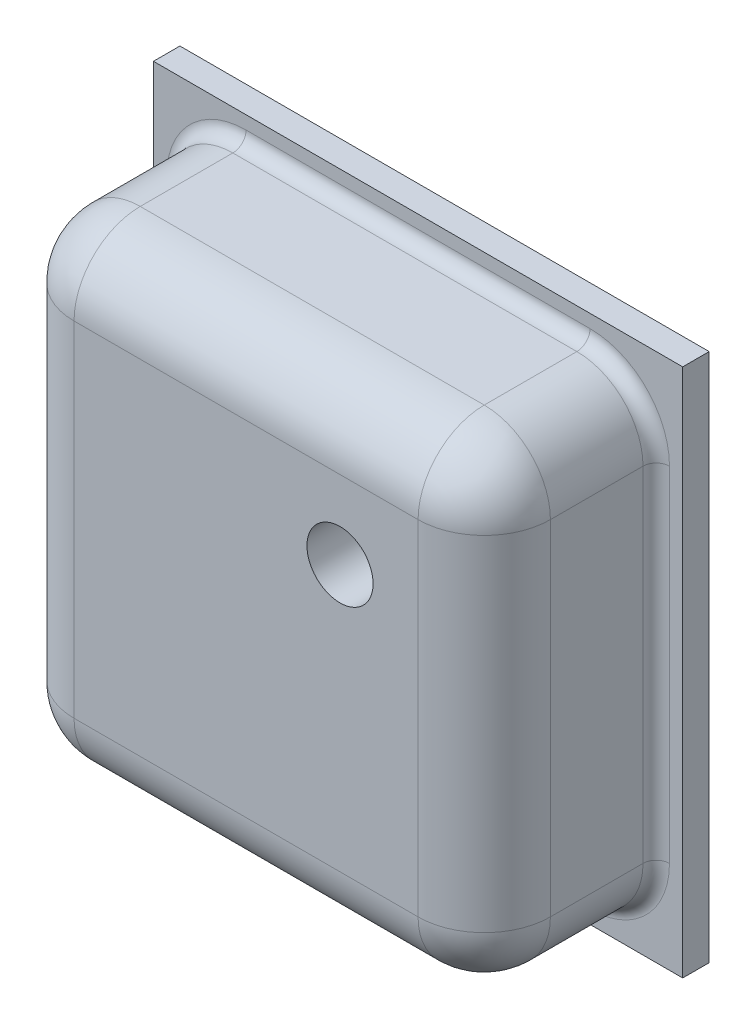
ISO-10303-21;
HEADER;
FILE_DESCRIPTION(('STEP AP214'),'2;1');
FILE_NAME('part.step','',(''),(''),'','','');
FILE_SCHEMA(('AUTOMOTIVE_DESIGN { 1 0 10303 214 1 1 1 1 }'));
ENDSEC;
DATA;
#1=APPLICATION_CONTEXT('core data for automotive mechanical design processes');
#2=APPLICATION_PROTOCOL_DEFINITION('international standard','automotive_design',2000,#1);
#3=PRODUCT_CONTEXT('',#1,'mechanical');
#4=PRODUCT('Part','Part','',(#3));
#5=PRODUCT_RELATED_PRODUCT_CATEGORY('part','',(#4));
#6=PRODUCT_DEFINITION_FORMATION('','',#4);
#7=PRODUCT_DEFINITION_CONTEXT('part definition',#1,'design');
#8=PRODUCT_DEFINITION('design','',#6,#7);
#9=PRODUCT_DEFINITION_SHAPE('','',#8);
#10=(LENGTH_UNIT() NAMED_UNIT(*) SI_UNIT(.MILLI.,.METRE.));
#11=(NAMED_UNIT(*) PLANE_ANGLE_UNIT() SI_UNIT($,.RADIAN.));
#12=(NAMED_UNIT(*) SI_UNIT($,.STERADIAN.) SOLID_ANGLE_UNIT());
#13=UNCERTAINTY_MEASURE_WITH_UNIT(LENGTH_MEASURE(1.E-05),#10,'distance_accuracy_value','');
#14=(GEOMETRIC_REPRESENTATION_CONTEXT(3) GLOBAL_UNCERTAINTY_ASSIGNED_CONTEXT((#13)) GLOBAL_UNIT_ASSIGNED_CONTEXT((#10,
#11,#12)) REPRESENTATION_CONTEXT('',''));
#15=CARTESIAN_POINT('',(0.,0.,0.));
#16=DIRECTION('',(0.,0.,1.));
#17=DIRECTION('',(1.,0.,0.));
#18=AXIS2_PLACEMENT_3D('',#15,#16,#17);
#19=CARTESIAN_POINT('',(0.,0.,0.1));
#20=DIRECTION('',(0.,0.,1.));
#21=DIRECTION('',(1.,0.,0.));
#22=AXIS2_PLACEMENT_3D('',#19,#20,#21);
#23=PLANE('',#22);
#24=DIRECTION('',(0.,-1.,0.));
#25=VECTOR('',#24,1.);
#26=CARTESIAN_POINT('',(0.949999999999999,0.,0.1));
#27=LINE('',#26,#25);
#28=CARTESIAN_POINT('',(0.949999999999999,0.65,0.1));
#29=VERTEX_POINT('',#28);
#30=CARTESIAN_POINT('',(0.949999999999999,-0.65,0.1));
#31=VERTEX_POINT('',#30);
#32=EDGE_CURVE('E276',#29,#31,#27,.T.);
#33=ORIENTED_EDGE('',*,*,#32,.T.);
#34=CARTESIAN_POINT('',(0.649999999999999,-0.65,0.1));
#35=DIRECTION('',(0.,0.,1.));
#36=DIRECTION('',(1.,0.,0.));
#37=AXIS2_PLACEMENT_3D('',#34,#35,#36);
#38=CIRCLE('',#37,0.3);
#39=CARTESIAN_POINT('',(0.649999999999999,-0.95,0.1));
#40=VERTEX_POINT('',#39);
#41=EDGE_CURVE('E278',#31,#40,#38,.F.);
#42=ORIENTED_EDGE('',*,*,#41,.T.);
#43=DIRECTION('',(-1.,0.,0.));
#44=VECTOR('',#43,1.);
#45=CARTESIAN_POINT('',(0.,-0.95,0.1));
#46=LINE('',#45,#44);
#47=CARTESIAN_POINT('',(-0.65,-0.95,0.1));
#48=VERTEX_POINT('',#47);
#49=EDGE_CURVE('E229',#40,#48,#46,.T.);
#50=ORIENTED_EDGE('',*,*,#49,.T.);
#51=CARTESIAN_POINT('',(-0.65,-0.65,0.1));
#52=DIRECTION('',(0.,0.,1.));
#53=DIRECTION('',(1.,0.,0.));
#54=AXIS2_PLACEMENT_3D('',#51,#52,#53);
#55=CIRCLE('',#54,0.3);
#56=CARTESIAN_POINT('',(-0.95,-0.65,0.1));
#57=VERTEX_POINT('',#56);
#58=EDGE_CURVE('E266',#48,#57,#55,.F.);
#59=ORIENTED_EDGE('',*,*,#58,.T.);
#60=DIRECTION('',(0.,1.,0.));
#61=VECTOR('',#60,1.);
#62=CARTESIAN_POINT('',(-0.950000000000001,0.,0.1));
#63=LINE('',#62,#61);
#64=CARTESIAN_POINT('',(-0.950000000000001,0.65,0.1));
#65=VERTEX_POINT('',#64);
#66=EDGE_CURVE('E268',#57,#65,#63,.T.);
#67=ORIENTED_EDGE('',*,*,#66,.T.);
#68=CARTESIAN_POINT('',(-0.650000000000001,0.65,0.1));
#69=DIRECTION('',(0.,0.,1.));
#70=DIRECTION('',(1.,0.,0.));
#71=AXIS2_PLACEMENT_3D('',#68,#69,#70);
#72=CIRCLE('',#71,0.3);
#73=CARTESIAN_POINT('',(-0.650000000000001,0.95,0.1));
#74=VERTEX_POINT('',#73);
#75=EDGE_CURVE('E270',#65,#74,#72,.F.);
#76=ORIENTED_EDGE('',*,*,#75,.T.);
#77=DIRECTION('',(1.,0.,0.));
#78=VECTOR('',#77,1.);
#79=CARTESIAN_POINT('',(0.,0.95,0.1));
#80=LINE('',#79,#78);
#81=CARTESIAN_POINT('',(0.649999999999999,0.95,0.1));
#82=VERTEX_POINT('',#81);
#83=EDGE_CURVE('E272',#74,#82,#80,.T.);
#84=ORIENTED_EDGE('',*,*,#83,.T.);
#85=CARTESIAN_POINT('',(0.649999999999999,0.65,0.1));
#86=DIRECTION('',(0.,0.,1.));
#87=DIRECTION('',(1.,0.,0.));
#88=AXIS2_PLACEMENT_3D('',#85,#86,#87);
#89=CIRCLE('',#88,0.3);
#90=EDGE_CURVE('E274',#82,#29,#89,.F.);
#91=ORIENTED_EDGE('',*,*,#90,.T.);
#92=EDGE_LOOP('',(#33,#42,#50,#59,#67,#76,#84,#91));
#93=FACE_BOUND('',#92,.T.);
#94=DIRECTION('',(0.,1.,0.));
#95=VECTOR('',#94,1.);
#96=CARTESIAN_POINT('',(0.999999999999999,1.,0.1));
#97=LINE('',#96,#95);
#98=CARTESIAN_POINT('',(0.999999999999999,-1.,0.1));
#99=VERTEX_POINT('',#98);
#100=CARTESIAN_POINT('',(0.999999999999999,1.,0.1));
#101=VERTEX_POINT('',#100);
#102=EDGE_CURVE('E175',#99,#101,#97,.T.);
#103=ORIENTED_EDGE('',*,*,#102,.T.);
#104=DIRECTION('',(-1.,0.,0.));
#105=VECTOR('',#104,1.);
#106=CARTESIAN_POINT('',(-1.,1.,0.1));
#107=LINE('',#106,#105);
#108=CARTESIAN_POINT('',(-1.,1.,0.1));
#109=VERTEX_POINT('',#108);
#110=EDGE_CURVE('E164',#101,#109,#107,.T.);
#111=ORIENTED_EDGE('',*,*,#110,.T.);
#112=DIRECTION('',(0.,-1.,0.));
#113=VECTOR('',#112,1.);
#114=CARTESIAN_POINT('',(-1.,1.,0.1));
#115=LINE('',#114,#113);
#116=CARTESIAN_POINT('',(-1.,-1.,0.1));
#117=VERTEX_POINT('',#116);
#118=EDGE_CURVE('E174',#109,#117,#115,.T.);
#119=ORIENTED_EDGE('',*,*,#118,.T.);
#120=DIRECTION('',(1.,0.,0.));
#121=VECTOR('',#120,1.);
#122=CARTESIAN_POINT('',(-1.,-1.,0.1));
#123=LINE('',#122,#121);
#124=EDGE_CURVE('E179',#117,#99,#123,.T.);
#125=ORIENTED_EDGE('',*,*,#124,.T.);
#126=EDGE_LOOP('',(#103,#111,#119,#125));
#127=FACE_BOUND('',#126,.T.);
#128=ADVANCED_FACE('F37',(#93,#127),#23,.T.);
#129=CARTESIAN_POINT('',(0.999999999999999,1.,0.1));
#130=DIRECTION('',(-1.,0.,0.));
#131=DIRECTION('',(0.,-1.,0.));
#132=AXIS2_PLACEMENT_3D('',#129,#130,#131);
#133=PLANE('',#132);
#134=DIRECTION('',(0.,1.,0.));
#135=VECTOR('',#134,1.);
#136=CARTESIAN_POINT('',(0.999999999999999,1.,0.));
#137=LINE('',#136,#135);
#138=CARTESIAN_POINT('',(0.999999999999999,-1.,0.));
#139=VERTEX_POINT('',#138);
#140=CARTESIAN_POINT('',(0.999999999999999,1.,0.));
#141=VERTEX_POINT('',#140);
#142=EDGE_CURVE('E187',#139,#141,#137,.T.);
#143=ORIENTED_EDGE('',*,*,#142,.T.);
#144=DIRECTION('',(0.,0.,-1.));
#145=VECTOR('',#144,1.);
#146=CARTESIAN_POINT('',(0.999999999999999,1.,0.1));
#147=LINE('',#146,#145);
#148=EDGE_CURVE('E168',#101,#141,#147,.T.);
#149=ORIENTED_EDGE('',*,*,#148,.F.);
#150=ORIENTED_EDGE('',*,*,#102,.F.);
#151=DIRECTION('',(0.,0.,-1.));
#152=VECTOR('',#151,1.);
#153=CARTESIAN_POINT('',(0.999999999999999,-1.,0.1));
#154=LINE('',#153,#152);
#155=EDGE_CURVE('E698',#99,#139,#154,.T.);
#156=ORIENTED_EDGE('',*,*,#155,.T.);
#157=EDGE_LOOP('',(#143,#149,#150,#156));
#158=FACE_BOUND('',#157,.T.);
#159=ADVANCED_FACE('F185',(#158),#133,.F.);
#160=CARTESIAN_POINT('',(-1.,1.,0.1));
#161=DIRECTION('',(0.,-1.,0.));
#162=DIRECTION('',(0.,0.,-1.));
#163=AXIS2_PLACEMENT_3D('',#160,#161,#162);
#164=PLANE('',#163);
#165=DIRECTION('',(-1.,0.,0.));
#166=VECTOR('',#165,1.);
#167=CARTESIAN_POINT('',(-1.,1.,0.));
#168=LINE('',#167,#166);
#169=CARTESIAN_POINT('',(-1.,1.,0.));
#170=VERTEX_POINT('',#169);
#171=EDGE_CURVE('E700',#141,#170,#168,.T.);
#172=ORIENTED_EDGE('',*,*,#171,.T.);
#173=DIRECTION('',(0.,0.,-1.));
#174=VECTOR('',#173,1.);
#175=CARTESIAN_POINT('',(-1.,1.,0.1));
#176=LINE('',#175,#174);
#177=EDGE_CURVE('E171',#109,#170,#176,.T.);
#178=ORIENTED_EDGE('',*,*,#177,.F.);
#179=ORIENTED_EDGE('',*,*,#110,.F.);
#180=ORIENTED_EDGE('',*,*,#148,.T.);
#181=EDGE_LOOP('',(#172,#178,#179,#180));
#182=FACE_BOUND('',#181,.T.);
#183=ADVANCED_FACE('F166',(#182),#164,.F.);
#184=CARTESIAN_POINT('',(-1.,1.,0.1));
#185=DIRECTION('',(1.,0.,0.));
#186=DIRECTION('',(0.,1.,0.));
#187=AXIS2_PLACEMENT_3D('',#184,#185,#186);
#188=PLANE('',#187);
#189=DIRECTION('',(0.,-1.,0.));
#190=VECTOR('',#189,1.);
#191=CARTESIAN_POINT('',(-1.,1.,0.));
#192=LINE('',#191,#190);
#193=CARTESIAN_POINT('',(-1.,-1.,0.));
#194=VERTEX_POINT('',#193);
#195=EDGE_CURVE('E702',#170,#194,#192,.T.);
#196=ORIENTED_EDGE('',*,*,#195,.T.);
#197=DIRECTION('',(0.,0.,-1.));
#198=VECTOR('',#197,1.);
#199=CARTESIAN_POINT('',(-1.,-1.,0.1));
#200=LINE('',#199,#198);
#201=EDGE_CURVE('E192',#117,#194,#200,.T.);
#202=ORIENTED_EDGE('',*,*,#201,.F.);
#203=ORIENTED_EDGE('',*,*,#118,.F.);
#204=ORIENTED_EDGE('',*,*,#177,.T.);
#205=EDGE_LOOP('',(#196,#202,#203,#204));
#206=FACE_BOUND('',#205,.T.);
#207=ADVANCED_FACE('F389',(#206),#188,.F.);
#208=CARTESIAN_POINT('',(-1.,-1.,0.1));
#209=DIRECTION('',(0.,1.,0.));
#210=DIRECTION('',(0.,0.,1.));
#211=AXIS2_PLACEMENT_3D('',#208,#209,#210);
#212=PLANE('',#211);
#213=DIRECTION('',(1.,0.,0.));
#214=VECTOR('',#213,1.);
#215=CARTESIAN_POINT('',(-1.,-1.,0.));
#216=LINE('',#215,#214);
#217=EDGE_CURVE('E183',#194,#139,#216,.T.);
#218=ORIENTED_EDGE('',*,*,#217,.T.);
#219=ORIENTED_EDGE('',*,*,#155,.F.);
#220=ORIENTED_EDGE('',*,*,#124,.F.);
#221=ORIENTED_EDGE('',*,*,#201,.T.);
#222=EDGE_LOOP('',(#218,#219,#220,#221));
#223=FACE_BOUND('',#222,.T.);
#224=ADVANCED_FACE('F385',(#223),#212,.F.);
#225=CARTESIAN_POINT('',(0.,0.,0.));
#226=DIRECTION('',(0.,0.,1.));
#227=DIRECTION('',(1.,0.,0.));
#228=AXIS2_PLACEMENT_3D('',#225,#226,#227);
#229=PLANE('',#228);
#230=ORIENTED_EDGE('',*,*,#142,.F.);
#231=ORIENTED_EDGE('',*,*,#217,.F.);
#232=ORIENTED_EDGE('',*,*,#195,.F.);
#233=ORIENTED_EDGE('',*,*,#171,.F.);
#234=EDGE_LOOP('',(#230,#231,#232,#233));
#235=FACE_BOUND('',#234,.T.);
#236=ADVANCED_FACE('F382',(#235),#229,.F.);
#237=CARTESIAN_POINT('',(-0.9,-0.9,0.75));
#238=DIRECTION('',(0.,1.,0.));
#239=DIRECTION('',(0.,0.,1.));
#240=AXIS2_PLACEMENT_3D('',#237,#238,#239);
#241=PLANE('',#240);
#242=DIRECTION('',(0.,0.,-1.));
#243=VECTOR('',#242,1.);
#244=CARTESIAN_POINT('',(-0.65,-0.9,0.75));
#245=LINE('',#244,#243);
#246=CARTESIAN_POINT('',(-0.65,-0.9,0.5));
#247=VERTEX_POINT('',#246);
#248=CARTESIAN_POINT('',(-0.65,-0.9,0.15));
#249=VERTEX_POINT('',#248);
#250=EDGE_CURVE('E207',#247,#249,#245,.T.);
#251=ORIENTED_EDGE('',*,*,#250,.T.);
#252=DIRECTION('',(-1.,0.,0.));
#253=VECTOR('',#252,1.);
#254=CARTESIAN_POINT('',(-0.9,-0.9,0.15));
#255=LINE('',#254,#253);
#256=CARTESIAN_POINT('',(0.649999999999999,-0.9,0.15));
#257=VERTEX_POINT('',#256);
#258=EDGE_CURVE('E11',#249,#257,#255,.F.);
#259=ORIENTED_EDGE('',*,*,#258,.T.);
#260=DIRECTION('',(0.,0.,-1.));
#261=VECTOR('',#260,1.);
#262=CARTESIAN_POINT('',(0.649999999999999,-0.9,0.75));
#263=LINE('',#262,#261);
#264=CARTESIAN_POINT('',(0.649999999999999,-0.9,0.5));
#265=VERTEX_POINT('',#264);
#266=EDGE_CURVE('E202',#257,#265,#263,.F.);
#267=ORIENTED_EDGE('',*,*,#266,.T.);
#268=DIRECTION('',(1.,0.,0.));
#269=VECTOR('',#268,1.);
#270=CARTESIAN_POINT('',(-0.9,-0.9,0.5));
#271=LINE('',#270,#269);
#272=EDGE_CURVE('E204',#265,#247,#271,.F.);
#273=ORIENTED_EDGE('',*,*,#272,.T.);
#274=EDGE_LOOP('',(#251,#259,#267,#273));
#275=FACE_BOUND('',#274,.T.);
#276=ADVANCED_FACE('F380',(#275),#241,.F.);
#277=CARTESIAN_POINT('',(0.899999999999999,-0.9,0.75));
#278=DIRECTION('',(-1.,0.,0.));
#279=DIRECTION('',(0.,-1.,0.));
#280=AXIS2_PLACEMENT_3D('',#277,#278,#279);
#281=PLANE('',#280);
#282=DIRECTION('',(0.,0.,-1.));
#283=VECTOR('',#282,1.);
#284=CARTESIAN_POINT('',(0.899999999999999,-0.65,0.75));
#285=LINE('',#284,#283);
#286=CARTESIAN_POINT('',(0.899999999999999,-0.65,0.5));
#287=VERTEX_POINT('',#286);
#288=CARTESIAN_POINT('',(0.899999999999999,-0.65,0.15));
#289=VERTEX_POINT('',#288);
#290=EDGE_CURVE('E209',#287,#289,#285,.T.);
#291=ORIENTED_EDGE('',*,*,#290,.T.);
#292=DIRECTION('',(0.,-1.,0.));
#293=VECTOR('',#292,1.);
#294=CARTESIAN_POINT('',(0.899999999999999,-0.9,0.15));
#295=LINE('',#294,#293);
#296=CARTESIAN_POINT('',(0.899999999999999,0.65,0.15));
#297=VERTEX_POINT('',#296);
#298=EDGE_CURVE('E284',#289,#297,#295,.F.);
#299=ORIENTED_EDGE('',*,*,#298,.T.);
#300=DIRECTION('',(0.,0.,-1.));
#301=VECTOR('',#300,1.);
#302=CARTESIAN_POINT('',(0.899999999999999,0.65,0.75));
#303=LINE('',#302,#301);
#304=CARTESIAN_POINT('',(0.899999999999999,0.65,0.5));
#305=VERTEX_POINT('',#304);
#306=EDGE_CURVE('E214',#297,#305,#303,.F.);
#307=ORIENTED_EDGE('',*,*,#306,.T.);
#308=DIRECTION('',(0.,1.,0.));
#309=VECTOR('',#308,1.);
#310=CARTESIAN_POINT('',(0.899999999999999,-0.9,0.5));
#311=LINE('',#310,#309);
#312=EDGE_CURVE('E212',#305,#287,#311,.F.);
#313=ORIENTED_EDGE('',*,*,#312,.T.);
#314=EDGE_LOOP('',(#291,#299,#307,#313));
#315=FACE_BOUND('',#314,.T.);
#316=ADVANCED_FACE('F602',(#315),#281,.F.);
#317=CARTESIAN_POINT('',(0.899999999999999,0.9,0.75));
#318=DIRECTION('',(0.,-1.,0.));
#319=DIRECTION('',(0.,0.,-1.));
#320=AXIS2_PLACEMENT_3D('',#317,#318,#319);
#321=PLANE('',#320);
#322=DIRECTION('',(0.,0.,-1.));
#323=VECTOR('',#322,1.);
#324=CARTESIAN_POINT('',(0.649999999999999,0.9,0.75));
#325=LINE('',#324,#323);
#326=CARTESIAN_POINT('',(0.649999999999999,0.9,0.5));
#327=VERTEX_POINT('',#326);
#328=CARTESIAN_POINT('',(0.649999999999999,0.9,0.15));
#329=VERTEX_POINT('',#328);
#330=EDGE_CURVE('E216',#327,#329,#325,.T.);
#331=ORIENTED_EDGE('',*,*,#330,.T.);
#332=DIRECTION('',(1.,0.,0.));
#333=VECTOR('',#332,1.);
#334=CARTESIAN_POINT('',(0.899999999999999,0.9,0.15));
#335=LINE('',#334,#333);
#336=CARTESIAN_POINT('',(-0.650000000000001,0.9,0.15));
#337=VERTEX_POINT('',#336);
#338=EDGE_CURVE('E288',#329,#337,#335,.F.);
#339=ORIENTED_EDGE('',*,*,#338,.T.);
#340=DIRECTION('',(0.,0.,-1.));
#341=VECTOR('',#340,1.);
#342=CARTESIAN_POINT('',(-0.650000000000001,0.9,0.75));
#343=LINE('',#342,#341);
#344=CARTESIAN_POINT('',(-0.650000000000001,0.9,0.5));
#345=VERTEX_POINT('',#344);
#346=EDGE_CURVE('E221',#337,#345,#343,.F.);
#347=ORIENTED_EDGE('',*,*,#346,.T.);
#348=DIRECTION('',(-1.,0.,0.));
#349=VECTOR('',#348,1.);
#350=CARTESIAN_POINT('',(0.899999999999999,0.9,0.5));
#351=LINE('',#350,#349);
#352=EDGE_CURVE('E219',#345,#327,#351,.F.);
#353=ORIENTED_EDGE('',*,*,#352,.T.);
#354=EDGE_LOOP('',(#331,#339,#347,#353));
#355=FACE_BOUND('',#354,.T.);
#356=ADVANCED_FACE('F594',(#355),#321,.F.);
#357=CARTESIAN_POINT('',(-0.900000000000001,0.9,0.75));
#358=DIRECTION('',(1.,0.,0.));
#359=DIRECTION('',(0.,1.,0.));
#360=AXIS2_PLACEMENT_3D('',#357,#358,#359);
#361=PLANE('',#360);
#362=DIRECTION('',(0.,0.,-1.));
#363=VECTOR('',#362,1.);
#364=CARTESIAN_POINT('',(-0.900000000000001,0.65,0.75));
#365=LINE('',#364,#363);
#366=CARTESIAN_POINT('',(-0.900000000000001,0.65,0.5));
#367=VERTEX_POINT('',#366);
#368=CARTESIAN_POINT('',(-0.900000000000001,0.65,0.15));
#369=VERTEX_POINT('',#368);
#370=EDGE_CURVE('E227',#367,#369,#365,.T.);
#371=ORIENTED_EDGE('',*,*,#370,.T.);
#372=DIRECTION('',(0.,1.,0.));
#373=VECTOR('',#372,1.);
#374=CARTESIAN_POINT('',(-0.900000000000001,0.9,0.15));
#375=LINE('',#374,#373);
#376=CARTESIAN_POINT('',(-0.9,-0.65,0.15));
#377=VERTEX_POINT('',#376);
#378=EDGE_CURVE('E61',#369,#377,#375,.F.);
#379=ORIENTED_EDGE('',*,*,#378,.T.);
#380=DIRECTION('',(0.,0.,-1.));
#381=VECTOR('',#380,1.);
#382=CARTESIAN_POINT('',(-0.9,-0.65,0.75));
#383=LINE('',#382,#381);
#384=CARTESIAN_POINT('',(-0.9,-0.65,0.5));
#385=VERTEX_POINT('',#384);
#386=EDGE_CURVE('E223',#377,#385,#383,.F.);
#387=ORIENTED_EDGE('',*,*,#386,.T.);
#388=DIRECTION('',(0.,-1.,0.));
#389=VECTOR('',#388,1.);
#390=CARTESIAN_POINT('',(-0.900000000000001,0.9,0.5));
#391=LINE('',#390,#389);
#392=EDGE_CURVE('E225',#385,#367,#391,.F.);
#393=ORIENTED_EDGE('',*,*,#392,.T.);
#394=EDGE_LOOP('',(#371,#379,#387,#393));
#395=FACE_BOUND('',#394,.T.);
#396=ADVANCED_FACE('F329',(#395),#361,.F.);
#397=CARTESIAN_POINT('',(0.,0.,0.75));
#398=DIRECTION('',(0.,0.,1.));
#399=DIRECTION('',(1.,0.,0.));
#400=AXIS2_PLACEMENT_3D('',#397,#398,#399);
#401=PLANE('',#400);
#402=DIRECTION('',(0.,-1.,0.));
#403=VECTOR('',#402,1.);
#404=CARTESIAN_POINT('',(-0.65,-0.9,0.75));
#405=LINE('',#404,#403);
#406=CARTESIAN_POINT('',(-0.650000000000001,0.65,0.75));
#407=VERTEX_POINT('',#406);
#408=CARTESIAN_POINT('',(-0.65,-0.65,0.75));
#409=VERTEX_POINT('',#408);
#410=EDGE_CURVE('E188',#407,#409,#405,.T.);
#411=ORIENTED_EDGE('',*,*,#410,.T.);
#412=DIRECTION('',(1.,0.,0.));
#413=VECTOR('',#412,1.);
#414=CARTESIAN_POINT('',(0.899999999999999,-0.65,0.75));
#415=LINE('',#414,#413);
#416=CARTESIAN_POINT('',(0.649999999999999,-0.65,0.75));
#417=VERTEX_POINT('',#416);
#418=EDGE_CURVE('E199',#409,#417,#415,.T.);
#419=ORIENTED_EDGE('',*,*,#418,.T.);
#420=DIRECTION('',(0.,1.,0.));
#421=VECTOR('',#420,1.);
#422=CARTESIAN_POINT('',(0.649999999999999,0.9,0.75));
#423=LINE('',#422,#421);
#424=CARTESIAN_POINT('',(0.649999999999999,0.65,0.75));
#425=VERTEX_POINT('',#424);
#426=EDGE_CURVE('E197',#417,#425,#423,.T.);
#427=ORIENTED_EDGE('',*,*,#426,.T.);
#428=DIRECTION('',(-1.,0.,0.));
#429=VECTOR('',#428,1.);
#430=CARTESIAN_POINT('',(-0.900000000000001,0.65,0.75));
#431=LINE('',#430,#429);
#432=EDGE_CURVE('E190',#425,#407,#431,.T.);
#433=ORIENTED_EDGE('',*,*,#432,.T.);
#434=EDGE_LOOP('',(#411,#419,#427,#433));
#435=FACE_BOUND('',#434,.T.);
#436=CARTESIAN_POINT('',(0.354999999999999,0.355,0.75));
#437=DIRECTION('',(0.,0.,1.));
#438=DIRECTION('',(1.,0.,0.));
#439=AXIS2_PLACEMENT_3D('',#436,#437,#438);
#440=CIRCLE('',#439,0.125);
#441=CARTESIAN_POINT('',(0.479999999999999,0.355,0.75));
#442=VERTEX_POINT('',#441);
#443=EDGE_CURVE('E264',#442,#442,#440,.T.);
#444=ORIENTED_EDGE('',*,*,#443,.F.);
#445=EDGE_LOOP('',(#444));
#446=FACE_BOUND('',#445,.T.);
#447=ADVANCED_FACE('F348',(#435,#446),#401,.T.);
#448=CARTESIAN_POINT('',(0.354999999999999,0.355,-0.253553390593274));
#449=DIRECTION('',(0.,0.,1.));
#450=DIRECTION('',(1.,0.,0.));
#451=AXIS2_PLACEMENT_3D('',#448,#449,#450);
#452=CYLINDRICAL_SURFACE('',#451,0.125);
#453=CARTESIAN_POINT('',(0.354999999999999,0.355,0.1));
#454=DIRECTION('',(0.,0.,1.));
#455=DIRECTION('',(1.,0.,0.));
#456=AXIS2_PLACEMENT_3D('',#453,#454,#455);
#457=CIRCLE('',#456,0.125);
#458=CARTESIAN_POINT('',(0.479999999999999,0.355,0.1));
#459=VERTEX_POINT('',#458);
#460=EDGE_CURVE('E690',#459,#459,#457,.F.);
#461=ORIENTED_EDGE('',*,*,#460,.T.);
#462=EDGE_LOOP('',(#461));
#463=FACE_BOUND('',#462,.T.);
#464=ORIENTED_EDGE('',*,*,#443,.T.);
#465=EDGE_LOOP('',(#464));
#466=FACE_BOUND('',#465,.T.);
#467=ADVANCED_FACE('F569',(#463,#466),#452,.F.);
#468=CARTESIAN_POINT('',(0.,0.,0.1));
#469=DIRECTION('',(0.,0.,1.));
#470=DIRECTION('',(1.,0.,0.));
#471=AXIS2_PLACEMENT_3D('',#468,#469,#470);
#472=PLANE('',#471);
#473=ORIENTED_EDGE('',*,*,#460,.F.);
#474=EDGE_LOOP('',(#473));
#475=FACE_BOUND('',#474,.T.);
#476=ADVANCED_FACE('F560',(#475),#472,.T.);
#477=CARTESIAN_POINT('',(-0.650000000000001,0.65,0.75));
#478=DIRECTION('',(0.,0.,-1.));
#479=DIRECTION('',(-1.,0.,0.));
#480=AXIS2_PLACEMENT_3D('',#477,#478,#479);
#481=CYLINDRICAL_SURFACE('',#480,0.25);
#482=ORIENTED_EDGE('',*,*,#346,.F.);
#483=CARTESIAN_POINT('',(-0.650000000000001,0.65,0.15));
#484=DIRECTION('',(0.,0.,1.));
#485=DIRECTION('',(1.,0.,0.));
#486=AXIS2_PLACEMENT_3D('',#483,#484,#485);
#487=CIRCLE('',#486,0.25);
#488=EDGE_CURVE('E290',#337,#369,#487,.T.);
#489=ORIENTED_EDGE('',*,*,#488,.T.);
#490=ORIENTED_EDGE('',*,*,#370,.F.);
#491=CARTESIAN_POINT('',(-0.650000000000001,0.65,0.5));
#492=DIRECTION('',(0.,0.,1.));
#493=DIRECTION('',(1.,0.,0.));
#494=AXIS2_PLACEMENT_3D('',#491,#492,#493);
#495=CIRCLE('',#494,0.25);
#496=EDGE_CURVE('E261',#345,#367,#495,.T.);
#497=ORIENTED_EDGE('',*,*,#496,.F.);
#498=EDGE_LOOP('',(#482,#489,#490,#497));
#499=FACE_BOUND('',#498,.T.);
#500=ADVANCED_FACE('F327',(#499),#481,.T.);
#501=CARTESIAN_POINT('',(0.,0.65,0.5));
#502=DIRECTION('',(1.,0.,0.));
#503=DIRECTION('',(0.,0.,-1.));
#504=AXIS2_PLACEMENT_3D('',#501,#502,#503);
#505=CYLINDRICAL_SURFACE('',#504,0.25);
#506=CARTESIAN_POINT('',(0.649999999999999,0.65,0.5));
#507=DIRECTION('',(1.,0.,0.));
#508=DIRECTION('',(0.,0.,-1.));
#509=AXIS2_PLACEMENT_3D('',#506,#507,#508);
#510=CIRCLE('',#509,0.25);
#511=EDGE_CURVE('E255',#327,#425,#510,.T.);
#512=ORIENTED_EDGE('',*,*,#511,.F.);
#513=ORIENTED_EDGE('',*,*,#352,.F.);
#514=CARTESIAN_POINT('',(-0.650000000000001,0.65,0.5));
#515=DIRECTION('',(-1.,0.,0.));
#516=DIRECTION('',(0.,0.,1.));
#517=AXIS2_PLACEMENT_3D('',#514,#515,#516);
#518=CIRCLE('',#517,0.25);
#519=EDGE_CURVE('E258',#407,#345,#518,.T.);
#520=ORIENTED_EDGE('',*,*,#519,.F.);
#521=ORIENTED_EDGE('',*,*,#432,.F.);
#522=EDGE_LOOP('',(#512,#513,#520,#521));
#523=FACE_BOUND('',#522,.T.);
#524=ADVANCED_FACE('F356',(#523),#505,.T.);
#525=CARTESIAN_POINT('',(0.649999999999999,0.65,0.75));
#526=DIRECTION('',(0.,0.,-1.));
#527=DIRECTION('',(-1.,0.,0.));
#528=AXIS2_PLACEMENT_3D('',#525,#526,#527);
#529=CYLINDRICAL_SURFACE('',#528,0.25);
#530=ORIENTED_EDGE('',*,*,#306,.F.);
#531=CARTESIAN_POINT('',(0.649999999999999,0.65,0.15));
#532=DIRECTION('',(0.,0.,1.));
#533=DIRECTION('',(1.,0.,0.));
#534=AXIS2_PLACEMENT_3D('',#531,#532,#533);
#535=CIRCLE('',#534,0.25);
#536=EDGE_CURVE('E286',#297,#329,#535,.T.);
#537=ORIENTED_EDGE('',*,*,#536,.T.);
#538=ORIENTED_EDGE('',*,*,#330,.F.);
#539=CARTESIAN_POINT('',(0.649999999999999,0.65,0.5));
#540=DIRECTION('',(0.,0.,1.));
#541=DIRECTION('',(1.,0.,0.));
#542=AXIS2_PLACEMENT_3D('',#539,#540,#541);
#543=CIRCLE('',#542,0.25);
#544=EDGE_CURVE('E252',#305,#327,#543,.T.);
#545=ORIENTED_EDGE('',*,*,#544,.F.);
#546=EDGE_LOOP('',(#530,#537,#538,#545));
#547=FACE_BOUND('',#546,.T.);
#548=ADVANCED_FACE('F361',(#547),#529,.T.);
#549=CARTESIAN_POINT('',(-0.650000000000001,0.65,0.5));
#550=DIRECTION('',(0.,0.,1.));
#551=DIRECTION('',(1.,0.,0.));
#552=AXIS2_PLACEMENT_3D('',#549,#550,#551);
#553=SPHERICAL_SURFACE('',#552,0.25);
#554=ORIENTED_EDGE('',*,*,#519,.T.);
#555=ORIENTED_EDGE('',*,*,#496,.T.);
#556=CARTESIAN_POINT('',(-0.650000000000001,0.65,0.5));
#557=DIRECTION('',(0.,1.,0.));
#558=DIRECTION('',(0.,0.,1.));
#559=AXIS2_PLACEMENT_3D('',#556,#557,#558);
#560=CIRCLE('',#559,0.25);
#561=EDGE_CURVE('E249',#407,#367,#560,.F.);
#562=ORIENTED_EDGE('',*,*,#561,.F.);
#563=EDGE_LOOP('',(#554,#555,#562));
#564=FACE_BOUND('',#563,.T.);
#565=ADVANCED_FACE('F358',(#564),#553,.T.);
#566=CARTESIAN_POINT('',(0.649999999999999,0.65,0.5));
#567=DIRECTION('',(0.,0.,1.));
#568=DIRECTION('',(1.,0.,0.));
#569=AXIS2_PLACEMENT_3D('',#566,#567,#568);
#570=SPHERICAL_SURFACE('',#569,0.25);
#571=ORIENTED_EDGE('',*,*,#544,.T.);
#572=ORIENTED_EDGE('',*,*,#511,.T.);
#573=CARTESIAN_POINT('',(0.649999999999999,0.65,0.5));
#574=DIRECTION('',(0.,1.,0.));
#575=DIRECTION('',(0.,0.,1.));
#576=AXIS2_PLACEMENT_3D('',#573,#574,#575);
#577=CIRCLE('',#576,0.25);
#578=EDGE_CURVE('E246',#305,#425,#577,.F.);
#579=ORIENTED_EDGE('',*,*,#578,.F.);
#580=EDGE_LOOP('',(#571,#572,#579));
#581=FACE_BOUND('',#580,.T.);
#582=ADVANCED_FACE('F360',(#581),#570,.T.);
#583=CARTESIAN_POINT('',(-0.65,-0.65,0.75));
#584=DIRECTION('',(0.,0.,-1.));
#585=DIRECTION('',(-1.,0.,0.));
#586=AXIS2_PLACEMENT_3D('',#583,#584,#585);
#587=CYLINDRICAL_SURFACE('',#586,0.25);
#588=ORIENTED_EDGE('',*,*,#386,.F.);
#589=CARTESIAN_POINT('',(-0.65,-0.65,0.15));
#590=DIRECTION('',(0.,0.,1.));
#591=DIRECTION('',(1.,0.,0.));
#592=AXIS2_PLACEMENT_3D('',#589,#590,#591);
#593=CIRCLE('',#592,0.25);
#594=EDGE_CURVE('E46',#377,#249,#593,.T.);
#595=ORIENTED_EDGE('',*,*,#594,.T.);
#596=ORIENTED_EDGE('',*,*,#250,.F.);
#597=CARTESIAN_POINT('',(-0.65,-0.65,0.5));
#598=DIRECTION('',(0.,0.,1.));
#599=DIRECTION('',(1.,0.,0.));
#600=AXIS2_PLACEMENT_3D('',#597,#598,#599);
#601=CIRCLE('',#600,0.25);
#602=EDGE_CURVE('E243',#385,#247,#601,.T.);
#603=ORIENTED_EDGE('',*,*,#602,.F.);
#604=EDGE_LOOP('',(#588,#595,#596,#603));
#605=FACE_BOUND('',#604,.T.);
#606=ADVANCED_FACE('F338',(#605),#587,.T.);
#607=CARTESIAN_POINT('',(-0.65,0.,0.5));
#608=DIRECTION('',(0.,1.,0.));
#609=DIRECTION('',(-1.,0.,0.));
#610=AXIS2_PLACEMENT_3D('',#607,#608,#609);
#611=CYLINDRICAL_SURFACE('',#610,0.25);
#612=ORIENTED_EDGE('',*,*,#561,.T.);
#613=ORIENTED_EDGE('',*,*,#392,.F.);
#614=CARTESIAN_POINT('',(-0.65,-0.65,0.5));
#615=DIRECTION('',(0.,-1.,0.));
#616=DIRECTION('',(0.,0.,-1.));
#617=AXIS2_PLACEMENT_3D('',#614,#615,#616);
#618=CIRCLE('',#617,0.25);
#619=EDGE_CURVE('E240',#409,#385,#618,.T.);
#620=ORIENTED_EDGE('',*,*,#619,.F.);
#621=ORIENTED_EDGE('',*,*,#410,.F.);
#622=EDGE_LOOP('',(#612,#613,#620,#621));
#623=FACE_BOUND('',#622,.T.);
#624=ADVANCED_FACE('F334',(#623),#611,.T.);
#625=CARTESIAN_POINT('',(0.649999999999999,0.,0.5));
#626=DIRECTION('',(0.,-1.,0.));
#627=DIRECTION('',(1.,0.,0.));
#628=AXIS2_PLACEMENT_3D('',#625,#626,#627);
#629=CYLINDRICAL_SURFACE('',#628,0.25);
#630=ORIENTED_EDGE('',*,*,#578,.T.);
#631=ORIENTED_EDGE('',*,*,#426,.F.);
#632=CARTESIAN_POINT('',(0.649999999999999,-0.65,0.5));
#633=DIRECTION('',(0.,-1.,0.));
#634=DIRECTION('',(0.,0.,-1.));
#635=AXIS2_PLACEMENT_3D('',#632,#633,#634);
#636=CIRCLE('',#635,0.25);
#637=EDGE_CURVE('E237',#287,#417,#636,.T.);
#638=ORIENTED_EDGE('',*,*,#637,.F.);
#639=ORIENTED_EDGE('',*,*,#312,.F.);
#640=EDGE_LOOP('',(#630,#631,#638,#639));
#641=FACE_BOUND('',#640,.T.);
#642=ADVANCED_FACE('F407',(#641),#629,.T.);
#643=CARTESIAN_POINT('',(0.649999999999999,-0.65,0.75));
#644=DIRECTION('',(0.,0.,-1.));
#645=DIRECTION('',(-1.,0.,0.));
#646=AXIS2_PLACEMENT_3D('',#643,#644,#645);
#647=CYLINDRICAL_SURFACE('',#646,0.25);
#648=ORIENTED_EDGE('',*,*,#266,.F.);
#649=CARTESIAN_POINT('',(0.649999999999999,-0.65,0.15));
#650=DIRECTION('',(0.,0.,1.));
#651=DIRECTION('',(1.,0.,0.));
#652=AXIS2_PLACEMENT_3D('',#649,#650,#651);
#653=CIRCLE('',#652,0.25);
#654=EDGE_CURVE('E281',#257,#289,#653,.T.);
#655=ORIENTED_EDGE('',*,*,#654,.T.);
#656=ORIENTED_EDGE('',*,*,#290,.F.);
#657=CARTESIAN_POINT('',(0.649999999999999,-0.65,0.5));
#658=DIRECTION('',(0.,0.,1.));
#659=DIRECTION('',(1.,0.,0.));
#660=AXIS2_PLACEMENT_3D('',#657,#658,#659);
#661=CIRCLE('',#660,0.25);
#662=EDGE_CURVE('E234',#265,#287,#661,.T.);
#663=ORIENTED_EDGE('',*,*,#662,.F.);
#664=EDGE_LOOP('',(#648,#655,#656,#663));
#665=FACE_BOUND('',#664,.T.);
#666=ADVANCED_FACE('F404',(#665),#647,.T.);
#667=CARTESIAN_POINT('',(-0.65,-0.65,0.5));
#668=DIRECTION('',(0.,0.,1.));
#669=DIRECTION('',(1.,0.,0.));
#670=AXIS2_PLACEMENT_3D('',#667,#668,#669);
#671=SPHERICAL_SURFACE('',#670,0.25);
#672=ORIENTED_EDGE('',*,*,#619,.T.);
#673=ORIENTED_EDGE('',*,*,#602,.T.);
#674=CARTESIAN_POINT('',(-0.65,-0.65,0.5));
#675=DIRECTION('',(-1.,0.,0.));
#676=DIRECTION('',(0.,0.,1.));
#677=AXIS2_PLACEMENT_3D('',#674,#675,#676);
#678=CIRCLE('',#677,0.25);
#679=EDGE_CURVE('E232',#409,#247,#678,.F.);
#680=ORIENTED_EDGE('',*,*,#679,.F.);
#681=EDGE_LOOP('',(#672,#673,#680));
#682=FACE_BOUND('',#681,.T.);
#683=ADVANCED_FACE('F341',(#682),#671,.T.);
#684=CARTESIAN_POINT('',(0.649999999999999,-0.65,0.5));
#685=DIRECTION('',(0.,0.,1.));
#686=DIRECTION('',(1.,0.,0.));
#687=AXIS2_PLACEMENT_3D('',#684,#685,#686);
#688=SPHERICAL_SURFACE('',#687,0.25);
#689=ORIENTED_EDGE('',*,*,#662,.T.);
#690=ORIENTED_EDGE('',*,*,#637,.T.);
#691=CARTESIAN_POINT('',(0.649999999999999,-0.65,0.5));
#692=DIRECTION('',(1.,0.,0.));
#693=DIRECTION('',(0.,0.,-1.));
#694=AXIS2_PLACEMENT_3D('',#691,#692,#693);
#695=CIRCLE('',#694,0.25);
#696=EDGE_CURVE('E230',#265,#417,#695,.F.);
#697=ORIENTED_EDGE('',*,*,#696,.F.);
#698=EDGE_LOOP('',(#689,#690,#697));
#699=FACE_BOUND('',#698,.T.);
#700=ADVANCED_FACE('F398',(#699),#688,.T.);
#701=CARTESIAN_POINT('',(0.,-0.65,0.5));
#702=DIRECTION('',(-1.,0.,0.));
#703=DIRECTION('',(0.,0.,1.));
#704=AXIS2_PLACEMENT_3D('',#701,#702,#703);
#705=CYLINDRICAL_SURFACE('',#704,0.25);
#706=ORIENTED_EDGE('',*,*,#679,.T.);
#707=ORIENTED_EDGE('',*,*,#272,.F.);
#708=ORIENTED_EDGE('',*,*,#696,.T.);
#709=ORIENTED_EDGE('',*,*,#418,.F.);
#710=EDGE_LOOP('',(#706,#707,#708,#709));
#711=FACE_BOUND('',#710,.T.);
#712=ADVANCED_FACE('F345',(#711),#705,.T.);
#713=CARTESIAN_POINT('',(-0.650000000000001,0.65,0.15));
#714=DIRECTION('',(0.,0.,1.));
#715=DIRECTION('',(1.,0.,0.));
#716=AXIS2_PLACEMENT_3D('',#713,#714,#715);
#717=TOROIDAL_SURFACE('',#716,0.3,0.05);
#718=CARTESIAN_POINT('',(-0.950000000000001,0.65,0.15));
#719=DIRECTION('',(0.,1.,0.));
#720=DIRECTION('',(0.,0.,1.));
#721=AXIS2_PLACEMENT_3D('',#718,#719,#720);
#722=CIRCLE('',#721,0.05);
#723=EDGE_CURVE('E309',#369,#65,#722,.T.);
#724=ORIENTED_EDGE('',*,*,#723,.F.);
#725=ORIENTED_EDGE('',*,*,#488,.F.);
#726=CARTESIAN_POINT('',(-0.650000000000001,0.95,0.15));
#727=DIRECTION('',(-1.,0.,0.));
#728=DIRECTION('',(0.,0.,1.));
#729=AXIS2_PLACEMENT_3D('',#726,#727,#728);
#730=CIRCLE('',#729,0.05);
#731=EDGE_CURVE('E41',#74,#337,#730,.T.);
#732=ORIENTED_EDGE('',*,*,#731,.F.);
#733=ORIENTED_EDGE('',*,*,#75,.F.);
#734=EDGE_LOOP('',(#724,#725,#732,#733));
#735=FACE_BOUND('',#734,.T.);
#736=ADVANCED_FACE('F39',(#735),#717,.F.);
#737=CARTESIAN_POINT('',(0.,0.95,0.15));
#738=DIRECTION('',(1.,0.,0.));
#739=DIRECTION('',(0.,0.,-1.));
#740=AXIS2_PLACEMENT_3D('',#737,#738,#739);
#741=CYLINDRICAL_SURFACE('',#740,0.05);
#742=ORIENTED_EDGE('',*,*,#731,.T.);
#743=ORIENTED_EDGE('',*,*,#338,.F.);
#744=CARTESIAN_POINT('',(0.649999999999999,0.95,0.15));
#745=DIRECTION('',(-1.,0.,0.));
#746=DIRECTION('',(0.,0.,1.));
#747=AXIS2_PLACEMENT_3D('',#744,#745,#746);
#748=CIRCLE('',#747,0.05);
#749=EDGE_CURVE('E307',#82,#329,#748,.T.);
#750=ORIENTED_EDGE('',*,*,#749,.F.);
#751=ORIENTED_EDGE('',*,*,#83,.F.);
#752=EDGE_LOOP('',(#742,#743,#750,#751));
#753=FACE_BOUND('',#752,.T.);
#754=ADVANCED_FACE('F319',(#753),#741,.F.);
#755=CARTESIAN_POINT('',(-0.950000000000001,0.,0.15));
#756=DIRECTION('',(0.,1.,0.));
#757=DIRECTION('',(-1.,0.,0.));
#758=AXIS2_PLACEMENT_3D('',#755,#756,#757);
#759=CYLINDRICAL_SURFACE('',#758,0.05);
#760=ORIENTED_EDGE('',*,*,#723,.T.);
#761=ORIENTED_EDGE('',*,*,#66,.F.);
#762=CARTESIAN_POINT('',(-0.95,-0.65,0.15));
#763=DIRECTION('',(0.,1.,0.));
#764=DIRECTION('',(0.,0.,1.));
#765=AXIS2_PLACEMENT_3D('',#762,#763,#764);
#766=CIRCLE('',#765,0.05);
#767=EDGE_CURVE('E304',#377,#57,#766,.T.);
#768=ORIENTED_EDGE('',*,*,#767,.F.);
#769=ORIENTED_EDGE('',*,*,#378,.F.);
#770=EDGE_LOOP('',(#760,#761,#768,#769));
#771=FACE_BOUND('',#770,.T.);
#772=ADVANCED_FACE('F456',(#771),#759,.F.);
#773=CARTESIAN_POINT('',(0.649999999999999,0.65,0.15));
#774=DIRECTION('',(0.,0.,1.));
#775=DIRECTION('',(1.,0.,0.));
#776=AXIS2_PLACEMENT_3D('',#773,#774,#775);
#777=TOROIDAL_SURFACE('',#776,0.3,0.05);
#778=ORIENTED_EDGE('',*,*,#749,.T.);
#779=ORIENTED_EDGE('',*,*,#536,.F.);
#780=CARTESIAN_POINT('',(0.949999999999999,0.65,0.15));
#781=DIRECTION('',(0.,1.,0.));
#782=DIRECTION('',(0.,0.,1.));
#783=AXIS2_PLACEMENT_3D('',#780,#781,#782);
#784=CIRCLE('',#783,0.05);
#785=EDGE_CURVE('E301',#29,#297,#784,.T.);
#786=ORIENTED_EDGE('',*,*,#785,.F.);
#787=ORIENTED_EDGE('',*,*,#90,.F.);
#788=EDGE_LOOP('',(#778,#779,#786,#787));
#789=FACE_BOUND('',#788,.T.);
#790=ADVANCED_FACE('F462',(#789),#777,.F.);
#791=CARTESIAN_POINT('',(-0.65,-0.65,0.15));
#792=DIRECTION('',(0.,0.,1.));
#793=DIRECTION('',(1.,0.,0.));
#794=AXIS2_PLACEMENT_3D('',#791,#792,#793);
#795=TOROIDAL_SURFACE('',#794,0.3,0.05);
#796=ORIENTED_EDGE('',*,*,#767,.T.);
#797=ORIENTED_EDGE('',*,*,#58,.F.);
#798=CARTESIAN_POINT('',(-0.65,-0.95,0.15));
#799=DIRECTION('',(-1.,0.,0.));
#800=DIRECTION('',(0.,0.,1.));
#801=AXIS2_PLACEMENT_3D('',#798,#799,#800);
#802=CIRCLE('',#801,0.05);
#803=EDGE_CURVE('E298',#249,#48,#802,.T.);
#804=ORIENTED_EDGE('',*,*,#803,.F.);
#805=ORIENTED_EDGE('',*,*,#594,.F.);
#806=EDGE_LOOP('',(#796,#797,#804,#805));
#807=FACE_BOUND('',#806,.T.);
#808=ADVANCED_FACE('F469',(#807),#795,.F.);
#809=CARTESIAN_POINT('',(0.949999999999999,0.,0.15));
#810=DIRECTION('',(0.,-1.,0.));
#811=DIRECTION('',(1.,0.,0.));
#812=AXIS2_PLACEMENT_3D('',#809,#810,#811);
#813=CYLINDRICAL_SURFACE('',#812,0.05);
#814=ORIENTED_EDGE('',*,*,#785,.T.);
#815=ORIENTED_EDGE('',*,*,#298,.F.);
#816=CARTESIAN_POINT('',(0.949999999999999,-0.65,0.15));
#817=DIRECTION('',(0.,1.,0.));
#818=DIRECTION('',(0.,0.,1.));
#819=AXIS2_PLACEMENT_3D('',#816,#817,#818);
#820=CIRCLE('',#819,0.05);
#821=EDGE_CURVE('E296',#31,#289,#820,.T.);
#822=ORIENTED_EDGE('',*,*,#821,.F.);
#823=ORIENTED_EDGE('',*,*,#32,.F.);
#824=EDGE_LOOP('',(#814,#815,#822,#823));
#825=FACE_BOUND('',#824,.T.);
#826=ADVANCED_FACE('F477',(#825),#813,.F.);
#827=CARTESIAN_POINT('',(0.,-0.95,0.15));
#828=DIRECTION('',(-1.,0.,0.));
#829=DIRECTION('',(0.,0.,1.));
#830=AXIS2_PLACEMENT_3D('',#827,#828,#829);
#831=CYLINDRICAL_SURFACE('',#830,0.05);
#832=ORIENTED_EDGE('',*,*,#803,.T.);
#833=ORIENTED_EDGE('',*,*,#49,.F.);
#834=CARTESIAN_POINT('',(0.649999999999999,-0.95,0.15));
#835=DIRECTION('',(-1.,0.,0.));
#836=DIRECTION('',(0.,0.,1.));
#837=AXIS2_PLACEMENT_3D('',#834,#835,#836);
#838=CIRCLE('',#837,0.05);
#839=EDGE_CURVE('E294',#257,#40,#838,.T.);
#840=ORIENTED_EDGE('',*,*,#839,.F.);
#841=ORIENTED_EDGE('',*,*,#258,.F.);
#842=EDGE_LOOP('',(#832,#833,#840,#841));
#843=FACE_BOUND('',#842,.T.);
#844=ADVANCED_FACE('F485',(#843),#831,.F.);
#845=CARTESIAN_POINT('',(0.649999999999999,-0.65,0.15));
#846=DIRECTION('',(0.,0.,1.));
#847=DIRECTION('',(1.,0.,0.));
#848=AXIS2_PLACEMENT_3D('',#845,#846,#847);
#849=TOROIDAL_SURFACE('',#848,0.3,0.05);
#850=ORIENTED_EDGE('',*,*,#821,.T.);
#851=ORIENTED_EDGE('',*,*,#654,.F.);
#852=ORIENTED_EDGE('',*,*,#839,.T.);
#853=ORIENTED_EDGE('',*,*,#41,.F.);
#854=EDGE_LOOP('',(#850,#851,#852,#853));
#855=FACE_BOUND('',#854,.T.);
#856=ADVANCED_FACE('F493',(#855),#849,.F.);
#857=CLOSED_SHELL('',(#128,#159,#183,#207,#224,#236,#276,#316,#356,#396,#447,#467,#476,#500,
#524,#548,#565,#582,#606,#624,#642,#666,#683,#700,#712,#736,#754,#772,#790,#808,#826,#844,#856));
#858=MANIFOLD_SOLID_BREP('B2',#857);
#859=ADVANCED_BREP_SHAPE_REPRESENTATION('',(#18,#858),#14);
#860=SHAPE_DEFINITION_REPRESENTATION(#9,#859);
ENDSEC;
END-ISO-10303-21;
